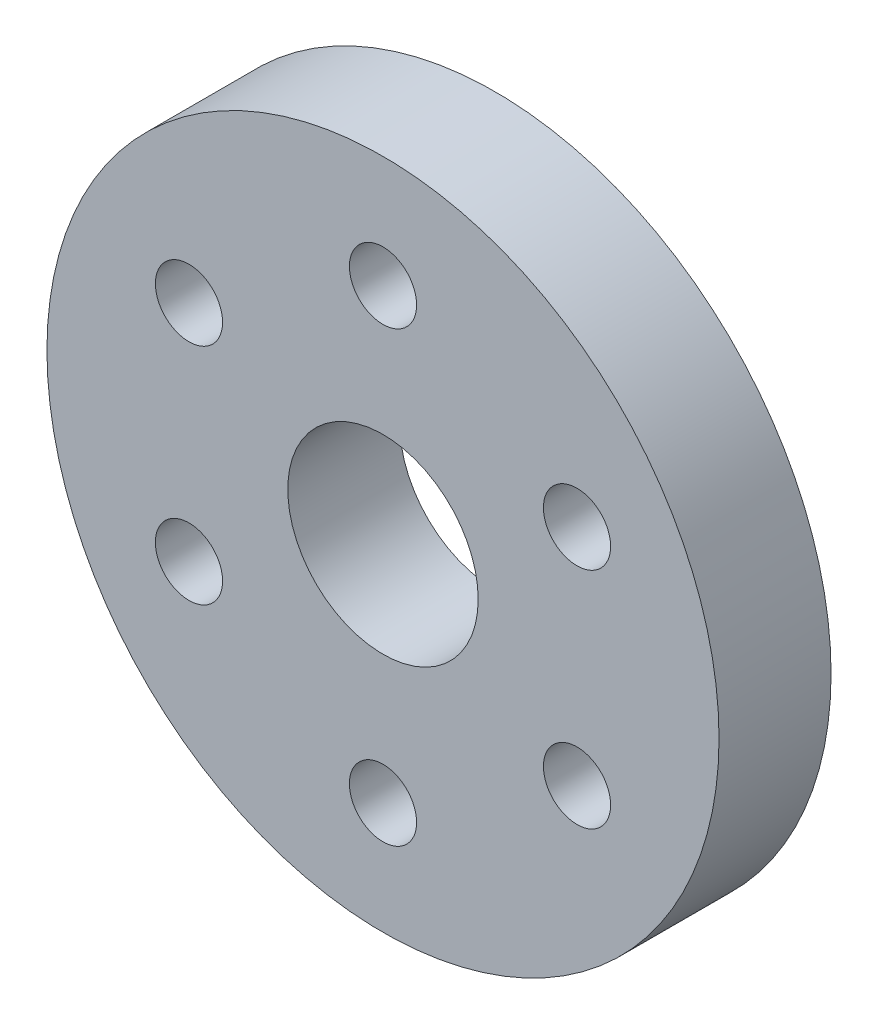
ISO-10303-21;
HEADER;
FILE_DESCRIPTION(('STEP AP214'),'2;1');
FILE_NAME('part.step','',(''),(''),'','','');
FILE_SCHEMA(('AUTOMOTIVE_DESIGN { 1 0 10303 214 1 1 1 1 }'));
ENDSEC;
DATA;
#1=APPLICATION_CONTEXT('core data for automotive mechanical design processes');
#2=APPLICATION_PROTOCOL_DEFINITION('international standard','automotive_design',2000,#1);
#3=PRODUCT_CONTEXT('',#1,'mechanical');
#4=PRODUCT('Part','Part','',(#3));
#5=PRODUCT_RELATED_PRODUCT_CATEGORY('part','',(#4));
#6=PRODUCT_DEFINITION_FORMATION('','',#4);
#7=PRODUCT_DEFINITION_CONTEXT('part definition',#1,'design');
#8=PRODUCT_DEFINITION('design','',#6,#7);
#9=PRODUCT_DEFINITION_SHAPE('','',#8);
#10=(LENGTH_UNIT() NAMED_UNIT(*) SI_UNIT(.MILLI.,.METRE.));
#11=(NAMED_UNIT(*) PLANE_ANGLE_UNIT() SI_UNIT($,.RADIAN.));
#12=(NAMED_UNIT(*) SI_UNIT($,.STERADIAN.) SOLID_ANGLE_UNIT());
#13=UNCERTAINTY_MEASURE_WITH_UNIT(LENGTH_MEASURE(1.E-05),#10,'distance_accuracy_value','');
#14=(GEOMETRIC_REPRESENTATION_CONTEXT(3) GLOBAL_UNCERTAINTY_ASSIGNED_CONTEXT((#13)) GLOBAL_UNIT_ASSIGNED_CONTEXT((#10,
#11,#12)) REPRESENTATION_CONTEXT('',''));
#15=CARTESIAN_POINT('',(0.,0.,0.));
#16=DIRECTION('',(0.,0.,1.));
#17=DIRECTION('',(1.,0.,0.));
#18=AXIS2_PLACEMENT_3D('',#15,#16,#17);
#19=CARTESIAN_POINT('',(0.,0.,5.));
#20=DIRECTION('',(0.,0.,1.));
#21=DIRECTION('',(1.,0.,0.));
#22=AXIS2_PLACEMENT_3D('',#19,#20,#21);
#23=PLANE('',#22);
#24=CARTESIAN_POINT('',(-8.66025403784443,-4.99999999999992,5.));
#25=DIRECTION('',(0.,0.,1.));
#26=DIRECTION('',(1.,0.,0.));
#27=AXIS2_PLACEMENT_3D('',#24,#25,#26);
#28=CIRCLE('',#27,1.5);
#29=CARTESIAN_POINT('',(-7.16025403784443,-4.99999999999992,5.));
#30=VERTEX_POINT('',#29);
#31=EDGE_CURVE('E71',#30,#30,#28,.T.);
#32=ORIENTED_EDGE('',*,*,#31,.F.);
#33=EDGE_LOOP('',(#32));
#34=FACE_BOUND('',#33,.T.);
#35=CARTESIAN_POINT('',(8.66025403784437,-5.00000000000004,5.));
#36=DIRECTION('',(0.,0.,1.));
#37=DIRECTION('',(1.,0.,0.));
#38=AXIS2_PLACEMENT_3D('',#35,#36,#37);
#39=CIRCLE('',#38,1.5);
#40=CARTESIAN_POINT('',(10.1602540378444,-5.00000000000004,5.));
#41=VERTEX_POINT('',#40);
#42=EDGE_CURVE('E59',#41,#41,#39,.T.);
#43=ORIENTED_EDGE('',*,*,#42,.F.);
#44=EDGE_LOOP('',(#43));
#45=FACE_BOUND('',#44,.T.);
#46=CARTESIAN_POINT('',(0.,10.,5.));
#47=DIRECTION('',(0.,0.,1.));
#48=DIRECTION('',(1.,0.,0.));
#49=AXIS2_PLACEMENT_3D('',#46,#47,#48);
#50=CIRCLE('',#49,1.5);
#51=CARTESIAN_POINT('',(1.5,10.,5.));
#52=VERTEX_POINT('',#51);
#53=EDGE_CURVE('E47',#52,#52,#50,.T.);
#54=ORIENTED_EDGE('',*,*,#53,.F.);
#55=EDGE_LOOP('',(#54));
#56=FACE_BOUND('',#55,.T.);
#57=CARTESIAN_POINT('',(0.,0.,5.));
#58=DIRECTION('',(0.,0.,1.));
#59=DIRECTION('',(1.,0.,0.));
#60=AXIS2_PLACEMENT_3D('',#57,#58,#59);
#61=CIRCLE('',#60,15.);
#62=CARTESIAN_POINT('',(15.,0.,5.));
#63=VERTEX_POINT('',#62);
#64=EDGE_CURVE('E10',#63,#63,#61,.T.);
#65=ORIENTED_EDGE('',*,*,#64,.T.);
#66=EDGE_LOOP('',(#65));
#67=FACE_BOUND('',#66,.T.);
#68=CARTESIAN_POINT('',(0.,0.,5.));
#69=DIRECTION('',(0.,0.,1.));
#70=DIRECTION('',(1.,0.,0.));
#71=AXIS2_PLACEMENT_3D('',#68,#69,#70);
#72=CIRCLE('',#71,4.25);
#73=CARTESIAN_POINT('',(4.25,0.,5.));
#74=VERTEX_POINT('',#73);
#75=EDGE_CURVE('E42',#74,#74,#72,.T.);
#76=ORIENTED_EDGE('',*,*,#75,.F.);
#77=EDGE_LOOP('',(#76));
#78=FACE_BOUND('',#77,.T.);
#79=CARTESIAN_POINT('',(8.66025403784447,4.99999999999986,5.));
#80=DIRECTION('',(0.,0.,1.));
#81=DIRECTION('',(1.,0.,0.));
#82=AXIS2_PLACEMENT_3D('',#79,#80,#81);
#83=CIRCLE('',#82,1.5);
#84=CARTESIAN_POINT('',(10.1602540378445,4.99999999999986,5.));
#85=VERTEX_POINT('',#84);
#86=EDGE_CURVE('E53',#85,#85,#83,.T.);
#87=ORIENTED_EDGE('',*,*,#86,.F.);
#88=EDGE_LOOP('',(#87));
#89=FACE_BOUND('',#88,.T.);
#90=CARTESIAN_POINT('',(0.,-10.,5.));
#91=DIRECTION('',(0.,0.,1.));
#92=DIRECTION('',(1.,0.,0.));
#93=AXIS2_PLACEMENT_3D('',#90,#91,#92);
#94=CIRCLE('',#93,1.5);
#95=CARTESIAN_POINT('',(1.49999999999993,-10.,5.));
#96=VERTEX_POINT('',#95);
#97=EDGE_CURVE('E65',#96,#96,#94,.T.);
#98=ORIENTED_EDGE('',*,*,#97,.F.);
#99=EDGE_LOOP('',(#98));
#100=FACE_BOUND('',#99,.T.);
#101=CARTESIAN_POINT('',(-8.66025403784433,5.0000000000001,5.));
#102=DIRECTION('',(0.,0.,1.));
#103=DIRECTION('',(1.,0.,0.));
#104=AXIS2_PLACEMENT_3D('',#101,#102,#103);
#105=CIRCLE('',#104,1.5);
#106=CARTESIAN_POINT('',(-7.16025403784433,5.0000000000001,5.));
#107=VERTEX_POINT('',#106);
#108=EDGE_CURVE('E77',#107,#107,#105,.T.);
#109=ORIENTED_EDGE('',*,*,#108,.F.);
#110=EDGE_LOOP('',(#109));
#111=FACE_BOUND('',#110,.T.);
#112=ADVANCED_FACE('F31',(#34,#45,#56,#67,#78,#89,#100,#111),#23,.T.);
#113=CARTESIAN_POINT('',(0.,0.,0.));
#114=DIRECTION('',(0.,0.,1.));
#115=DIRECTION('',(1.,0.,0.));
#116=AXIS2_PLACEMENT_3D('',#113,#114,#115);
#117=PLANE('',#116);
#118=CARTESIAN_POINT('',(0.,0.,0.));
#119=DIRECTION('',(0.,0.,1.));
#120=DIRECTION('',(1.,0.,0.));
#121=AXIS2_PLACEMENT_3D('',#118,#119,#120);
#122=CIRCLE('',#121,15.);
#123=CARTESIAN_POINT('',(15.,0.,0.));
#124=VERTEX_POINT('',#123);
#125=EDGE_CURVE('E35',#124,#124,#122,.T.);
#126=ORIENTED_EDGE('',*,*,#125,.F.);
#127=EDGE_LOOP('',(#126));
#128=FACE_BOUND('',#127,.T.);
#129=CARTESIAN_POINT('',(0.,0.,0.));
#130=DIRECTION('',(0.,0.,1.));
#131=DIRECTION('',(1.,0.,0.));
#132=AXIS2_PLACEMENT_3D('',#129,#130,#131);
#133=CIRCLE('',#132,4.25);
#134=CARTESIAN_POINT('',(4.25,0.,0.));
#135=VERTEX_POINT('',#134);
#136=EDGE_CURVE('E44',#135,#135,#133,.T.);
#137=ORIENTED_EDGE('',*,*,#136,.T.);
#138=EDGE_LOOP('',(#137));
#139=FACE_BOUND('',#138,.T.);
#140=CARTESIAN_POINT('',(0.,10.,0.));
#141=DIRECTION('',(0.,0.,1.));
#142=DIRECTION('',(1.,0.,0.));
#143=AXIS2_PLACEMENT_3D('',#140,#141,#142);
#144=CIRCLE('',#143,1.5);
#145=CARTESIAN_POINT('',(1.5,10.,0.));
#146=VERTEX_POINT('',#145);
#147=EDGE_CURVE('E50',#146,#146,#144,.T.);
#148=ORIENTED_EDGE('',*,*,#147,.T.);
#149=EDGE_LOOP('',(#148));
#150=FACE_BOUND('',#149,.T.);
#151=CARTESIAN_POINT('',(8.66025403784447,4.99999999999986,0.));
#152=DIRECTION('',(0.,0.,1.));
#153=DIRECTION('',(1.,0.,0.));
#154=AXIS2_PLACEMENT_3D('',#151,#152,#153);
#155=CIRCLE('',#154,1.5);
#156=CARTESIAN_POINT('',(10.1602540378445,4.99999999999986,0.));
#157=VERTEX_POINT('',#156);
#158=EDGE_CURVE('E56',#157,#157,#155,.T.);
#159=ORIENTED_EDGE('',*,*,#158,.T.);
#160=EDGE_LOOP('',(#159));
#161=FACE_BOUND('',#160,.T.);
#162=CARTESIAN_POINT('',(8.66025403784437,-5.00000000000004,0.));
#163=DIRECTION('',(0.,0.,1.));
#164=DIRECTION('',(1.,0.,0.));
#165=AXIS2_PLACEMENT_3D('',#162,#163,#164);
#166=CIRCLE('',#165,1.5);
#167=CARTESIAN_POINT('',(10.1602540378444,-5.00000000000004,0.));
#168=VERTEX_POINT('',#167);
#169=EDGE_CURVE('E62',#168,#168,#166,.T.);
#170=ORIENTED_EDGE('',*,*,#169,.T.);
#171=EDGE_LOOP('',(#170));
#172=FACE_BOUND('',#171,.T.);
#173=CARTESIAN_POINT('',(0.,-10.,0.));
#174=DIRECTION('',(0.,0.,1.));
#175=DIRECTION('',(1.,0.,0.));
#176=AXIS2_PLACEMENT_3D('',#173,#174,#175);
#177=CIRCLE('',#176,1.5);
#178=CARTESIAN_POINT('',(1.49999999999993,-10.,0.));
#179=VERTEX_POINT('',#178);
#180=EDGE_CURVE('E68',#179,#179,#177,.T.);
#181=ORIENTED_EDGE('',*,*,#180,.T.);
#182=EDGE_LOOP('',(#181));
#183=FACE_BOUND('',#182,.T.);
#184=CARTESIAN_POINT('',(-8.66025403784443,-4.99999999999992,0.));
#185=DIRECTION('',(0.,0.,1.));
#186=DIRECTION('',(1.,0.,0.));
#187=AXIS2_PLACEMENT_3D('',#184,#185,#186);
#188=CIRCLE('',#187,1.5);
#189=CARTESIAN_POINT('',(-7.16025403784443,-4.99999999999992,0.));
#190=VERTEX_POINT('',#189);
#191=EDGE_CURVE('E74',#190,#190,#188,.T.);
#192=ORIENTED_EDGE('',*,*,#191,.T.);
#193=EDGE_LOOP('',(#192));
#194=FACE_BOUND('',#193,.T.);
#195=CARTESIAN_POINT('',(-8.66025403784433,5.0000000000001,0.));
#196=DIRECTION('',(0.,0.,1.));
#197=DIRECTION('',(1.,0.,0.));
#198=AXIS2_PLACEMENT_3D('',#195,#196,#197);
#199=CIRCLE('',#198,1.5);
#200=CARTESIAN_POINT('',(-7.16025403784433,5.0000000000001,0.));
#201=VERTEX_POINT('',#200);
#202=EDGE_CURVE('E80',#201,#201,#199,.T.);
#203=ORIENTED_EDGE('',*,*,#202,.T.);
#204=EDGE_LOOP('',(#203));
#205=FACE_BOUND('',#204,.T.);
#206=ADVANCED_FACE('F90',(#128,#139,#150,#161,#172,#183,#194,#205),#117,.F.);
#207=CARTESIAN_POINT('',(0.,0.,5.));
#208=DIRECTION('',(0.,0.,-1.));
#209=DIRECTION('',(-1.,0.,0.));
#210=AXIS2_PLACEMENT_3D('',#207,#208,#209);
#211=CYLINDRICAL_SURFACE('',#210,15.);
#212=ORIENTED_EDGE('',*,*,#64,.F.);
#213=EDGE_LOOP('',(#212));
#214=FACE_BOUND('',#213,.T.);
#215=ORIENTED_EDGE('',*,*,#125,.T.);
#216=EDGE_LOOP('',(#215));
#217=FACE_BOUND('',#216,.T.);
#218=ADVANCED_FACE('F33',(#214,#217),#211,.T.);
#219=CARTESIAN_POINT('',(0.,0.,5.));
#220=DIRECTION('',(0.,0.,-1.));
#221=DIRECTION('',(-1.,0.,0.));
#222=AXIS2_PLACEMENT_3D('',#219,#220,#221);
#223=CYLINDRICAL_SURFACE('',#222,4.25);
#224=ORIENTED_EDGE('',*,*,#75,.T.);
#225=EDGE_LOOP('',(#224));
#226=FACE_BOUND('',#225,.T.);
#227=ORIENTED_EDGE('',*,*,#136,.F.);
#228=EDGE_LOOP('',(#227));
#229=FACE_BOUND('',#228,.T.);
#230=ADVANCED_FACE('F100',(#226,#229),#223,.F.);
#231=CARTESIAN_POINT('',(0.,10.,5.));
#232=DIRECTION('',(0.,0.,-1.));
#233=DIRECTION('',(-1.,0.,0.));
#234=AXIS2_PLACEMENT_3D('',#231,#232,#233);
#235=CYLINDRICAL_SURFACE('',#234,1.5);
#236=ORIENTED_EDGE('',*,*,#53,.T.);
#237=EDGE_LOOP('',(#236));
#238=FACE_BOUND('',#237,.T.);
#239=ORIENTED_EDGE('',*,*,#147,.F.);
#240=EDGE_LOOP('',(#239));
#241=FACE_BOUND('',#240,.T.);
#242=ADVANCED_FACE('F103',(#238,#241),#235,.F.);
#243=CARTESIAN_POINT('',(8.66025403784447,4.99999999999986,5.));
#244=DIRECTION('',(0.,0.,-1.));
#245=DIRECTION('',(-1.,0.,0.));
#246=AXIS2_PLACEMENT_3D('',#243,#244,#245);
#247=CYLINDRICAL_SURFACE('',#246,1.5);
#248=ORIENTED_EDGE('',*,*,#86,.T.);
#249=EDGE_LOOP('',(#248));
#250=FACE_BOUND('',#249,.T.);
#251=ORIENTED_EDGE('',*,*,#158,.F.);
#252=EDGE_LOOP('',(#251));
#253=FACE_BOUND('',#252,.T.);
#254=ADVANCED_FACE('F107',(#250,#253),#247,.F.);
#255=CARTESIAN_POINT('',(8.66025403784437,-5.00000000000004,5.));
#256=DIRECTION('',(0.,0.,-1.));
#257=DIRECTION('',(-1.,0.,0.));
#258=AXIS2_PLACEMENT_3D('',#255,#256,#257);
#259=CYLINDRICAL_SURFACE('',#258,1.5);
#260=ORIENTED_EDGE('',*,*,#42,.T.);
#261=EDGE_LOOP('',(#260));
#262=FACE_BOUND('',#261,.T.);
#263=ORIENTED_EDGE('',*,*,#169,.F.);
#264=EDGE_LOOP('',(#263));
#265=FACE_BOUND('',#264,.T.);
#266=ADVANCED_FACE('F111',(#262,#265),#259,.F.);
#267=CARTESIAN_POINT('',(0.,-10.,5.));
#268=DIRECTION('',(0.,0.,-1.));
#269=DIRECTION('',(-1.,0.,0.));
#270=AXIS2_PLACEMENT_3D('',#267,#268,#269);
#271=CYLINDRICAL_SURFACE('',#270,1.5);
#272=ORIENTED_EDGE('',*,*,#97,.T.);
#273=EDGE_LOOP('',(#272));
#274=FACE_BOUND('',#273,.T.);
#275=ORIENTED_EDGE('',*,*,#180,.F.);
#276=EDGE_LOOP('',(#275));
#277=FACE_BOUND('',#276,.T.);
#278=ADVANCED_FACE('F115',(#274,#277),#271,.F.);
#279=CARTESIAN_POINT('',(-8.66025403784443,-4.99999999999992,5.));
#280=DIRECTION('',(0.,0.,-1.));
#281=DIRECTION('',(-1.,0.,0.));
#282=AXIS2_PLACEMENT_3D('',#279,#280,#281);
#283=CYLINDRICAL_SURFACE('',#282,1.5);
#284=ORIENTED_EDGE('',*,*,#31,.T.);
#285=EDGE_LOOP('',(#284));
#286=FACE_BOUND('',#285,.T.);
#287=ORIENTED_EDGE('',*,*,#191,.F.);
#288=EDGE_LOOP('',(#287));
#289=FACE_BOUND('',#288,.T.);
#290=ADVANCED_FACE('F119',(#286,#289),#283,.F.);
#291=CARTESIAN_POINT('',(-8.66025403784433,5.0000000000001,5.));
#292=DIRECTION('',(0.,0.,-1.));
#293=DIRECTION('',(-1.,0.,0.));
#294=AXIS2_PLACEMENT_3D('',#291,#292,#293);
#295=CYLINDRICAL_SURFACE('',#294,1.5);
#296=ORIENTED_EDGE('',*,*,#108,.T.);
#297=EDGE_LOOP('',(#296));
#298=FACE_BOUND('',#297,.T.);
#299=ORIENTED_EDGE('',*,*,#202,.F.);
#300=EDGE_LOOP('',(#299));
#301=FACE_BOUND('',#300,.T.);
#302=ADVANCED_FACE('F86',(#298,#301),#295,.F.);
#303=CLOSED_SHELL('',(#112,#206,#218,#230,#242,#254,#266,#278,#290,#302));
#304=MANIFOLD_SOLID_BREP('B2',#303);
#305=ADVANCED_BREP_SHAPE_REPRESENTATION('',(#18,#304),#14);
#306=SHAPE_DEFINITION_REPRESENTATION(#9,#305);
ENDSEC;
END-ISO-10303-21;
